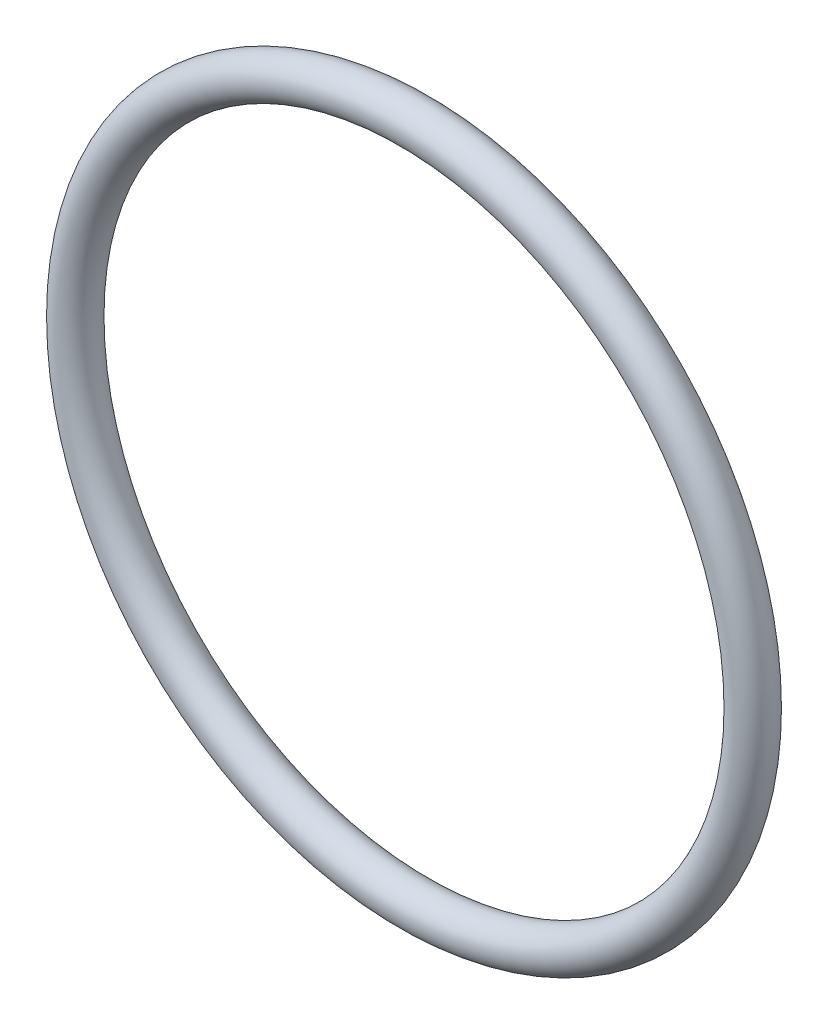
ISO-10303-21;
HEADER;
FILE_DESCRIPTION(('STEP AP214'),'2;1');
FILE_NAME('part.step','',(''),(''),'','','');
FILE_SCHEMA(('AUTOMOTIVE_DESIGN { 1 0 10303 214 1 1 1 1 }'));
ENDSEC;
DATA;
#1=APPLICATION_CONTEXT('core data for automotive mechanical design processes');
#2=APPLICATION_PROTOCOL_DEFINITION('international standard','automotive_design',2000,#1);
#3=PRODUCT_CONTEXT('',#1,'mechanical');
#4=PRODUCT('Part','Part','',(#3));
#5=PRODUCT_RELATED_PRODUCT_CATEGORY('part','',(#4));
#6=PRODUCT_DEFINITION_FORMATION('','',#4);
#7=PRODUCT_DEFINITION_CONTEXT('part definition',#1,'design');
#8=PRODUCT_DEFINITION('design','',#6,#7);
#9=PRODUCT_DEFINITION_SHAPE('','',#8);
#10=(LENGTH_UNIT() NAMED_UNIT(*) SI_UNIT(.MILLI.,.METRE.));
#11=(NAMED_UNIT(*) PLANE_ANGLE_UNIT() SI_UNIT($,.RADIAN.));
#12=(NAMED_UNIT(*) SI_UNIT($,.STERADIAN.) SOLID_ANGLE_UNIT());
#13=UNCERTAINTY_MEASURE_WITH_UNIT(LENGTH_MEASURE(1.E-05),#10,'distance_accuracy_value','');
#14=(GEOMETRIC_REPRESENTATION_CONTEXT(3) GLOBAL_UNCERTAINTY_ASSIGNED_CONTEXT((#13)) GLOBAL_UNIT_ASSIGNED_CONTEXT((#10,
#11,#12)) REPRESENTATION_CONTEXT('',''));
#15=CARTESIAN_POINT('',(0.,0.,0.));
#16=DIRECTION('',(0.,0.,1.));
#17=DIRECTION('',(1.,0.,0.));
#18=AXIS2_PLACEMENT_3D('',#15,#16,#17);
#19=CARTESIAN_POINT('',(0.,0.,0.));
#20=DIRECTION('',(0.,0.,1.));
#21=DIRECTION('',(1.,0.,0.));
#22=AXIS2_PLACEMENT_3D('',#19,#20,#21);
#23=TOROIDAL_SURFACE('',#22,25.,1.5);
#24=CARTESIAN_POINT('',(-25.,0.,0.));
#25=DIRECTION('',(0.,1.,0.));
#26=DIRECTION('',(0.,0.,1.));
#27=AXIS2_PLACEMENT_3D('',#24,#25,#26);
#28=CIRCLE('',#27,1.5);
#29=CARTESIAN_POINT('',(-26.5,0.,0.));
#30=VERTEX_POINT('',#29);
#31=EDGE_CURVE('E10',#30,#30,#28,.T.);
#32=CARTESIAN_POINT('',(0.,0.,0.));
#33=DIRECTION('',(0.,0.,1.));
#34=DIRECTION('',(1.,0.,0.));
#35=AXIS2_PLACEMENT_3D('',#32,#33,#34);
#36=CIRCLE('',#35,26.5);
#37=EDGE_CURVE('',#30,#30,#36,.T.);
#38=ORIENTED_EDGE('',*,*,#31,.F.);
#39=ORIENTED_EDGE('',*,*,#31,.T.);
#40=ORIENTED_EDGE('',*,*,#37,.T.);
#41=ORIENTED_EDGE('',*,*,#37,.F.);
#42=EDGE_LOOP('',(#38,#40,#39,#41));
#43=FACE_BOUND('',#42,.T.);
#44=ADVANCED_FACE('F37',(#43),#23,.T.);
#45=CLOSED_SHELL('',(#44));
#46=MANIFOLD_SOLID_BREP('B2',#45);
#47=ADVANCED_BREP_SHAPE_REPRESENTATION('',(#18,#46),#14);
#48=SHAPE_DEFINITION_REPRESENTATION(#9,#47);
ENDSEC;
END-ISO-10303-21;
